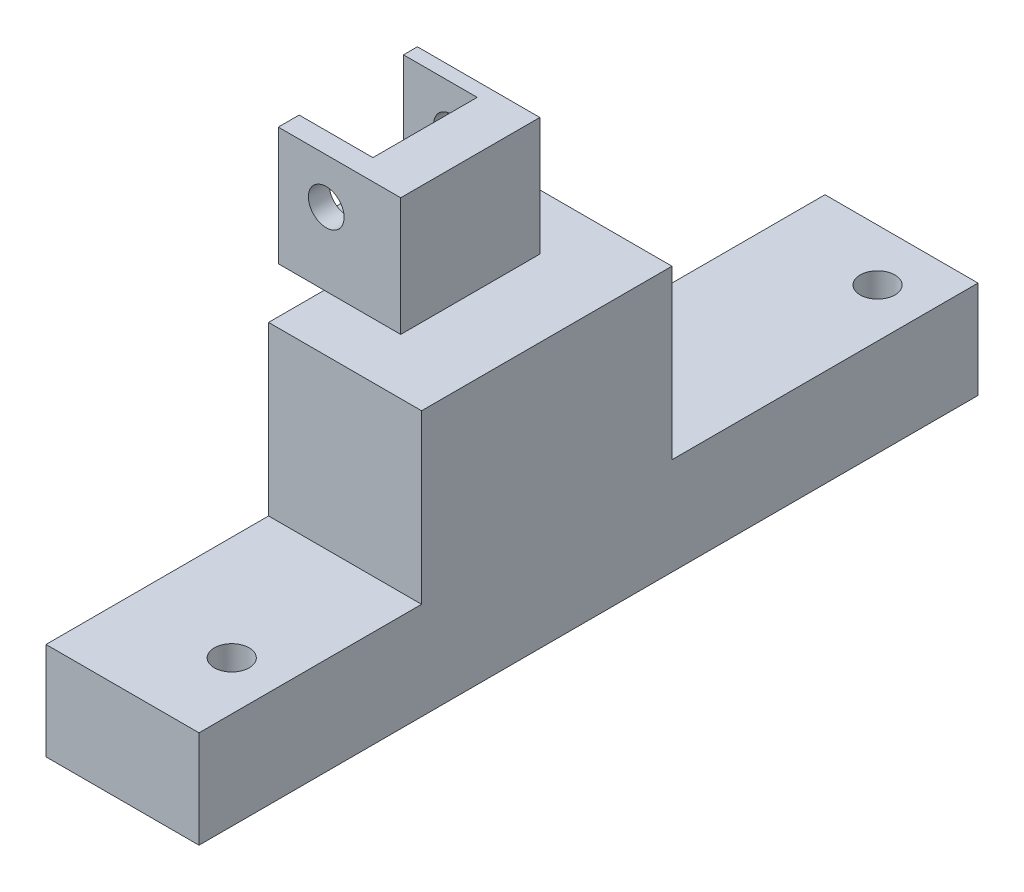
ISO-10303-21;
HEADER;
FILE_DESCRIPTION(('STEP AP214'),'2;1');
FILE_NAME('part.step','',(''),(''),'','','');
FILE_SCHEMA(('AUTOMOTIVE_DESIGN { 1 0 10303 214 1 1 1 1 }'));
ENDSEC;
DATA;
#1=APPLICATION_CONTEXT('core data for automotive mechanical design processes');
#2=APPLICATION_PROTOCOL_DEFINITION('international standard','automotive_design',2000,#1);
#3=PRODUCT_CONTEXT('',#1,'mechanical');
#4=PRODUCT('Part','Part','',(#3));
#5=PRODUCT_RELATED_PRODUCT_CATEGORY('part','',(#4));
#6=PRODUCT_DEFINITION_FORMATION('','',#4);
#7=PRODUCT_DEFINITION_CONTEXT('part definition',#1,'design');
#8=PRODUCT_DEFINITION('design','',#6,#7);
#9=PRODUCT_DEFINITION_SHAPE('','',#8);
#10=(LENGTH_UNIT() NAMED_UNIT(*) SI_UNIT(.MILLI.,.METRE.));
#11=(NAMED_UNIT(*) PLANE_ANGLE_UNIT() SI_UNIT($,.RADIAN.));
#12=(NAMED_UNIT(*) SI_UNIT($,.STERADIAN.) SOLID_ANGLE_UNIT());
#13=UNCERTAINTY_MEASURE_WITH_UNIT(LENGTH_MEASURE(1.E-05),#10,'distance_accuracy_value','');
#14=(GEOMETRIC_REPRESENTATION_CONTEXT(3) GLOBAL_UNCERTAINTY_ASSIGNED_CONTEXT((#13)) GLOBAL_UNIT_ASSIGNED_CONTEXT((#10,
#11,#12)) REPRESENTATION_CONTEXT('',''));
#15=CARTESIAN_POINT('',(0.,0.,0.));
#16=DIRECTION('',(0.,0.,1.));
#17=DIRECTION('',(1.,0.,0.));
#18=AXIS2_PLACEMENT_3D('',#15,#16,#17);
#19=CARTESIAN_POINT('',(801.33832114316,366.294436719435,-21.59));
#20=DIRECTION('',(0.,0.,1.));
#21=DIRECTION('',(1.,0.,0.));
#22=AXIS2_PLACEMENT_3D('',#19,#20,#21);
#23=CYLINDRICAL_SURFACE('',#22,9.52500000000012);
#24=DIRECTION('',(0.,0.,1.));
#25=VECTOR('',#24,1.);
#26=CARTESIAN_POINT('',(806.045825879218,374.574836719435,-21.59));
#27=LINE('',#26,#25);
#28=CARTESIAN_POINT('',(806.045825879218,374.574836719435,-19.05));
#29=VERTEX_POINT('',#28);
#30=CARTESIAN_POINT('',(806.045825879218,374.574836719435,0.));
#31=VERTEX_POINT('',#30);
#32=EDGE_CURVE('E56',#29,#31,#27,.T.);
#33=ORIENTED_EDGE('',*,*,#32,.F.);
#34=CARTESIAN_POINT('',(801.33832114316,366.294436719435,-19.05));
#35=DIRECTION('',(0.,0.,1.));
#36=DIRECTION('',(1.,0.,0.));
#37=AXIS2_PLACEMENT_3D('',#34,#35,#36);
#38=CIRCLE('',#37,9.52500000000004);
#39=CARTESIAN_POINT('',(801.33832114316,356.769436719435,-19.05));
#40=VERTEX_POINT('',#39);
#41=EDGE_CURVE('E290',#29,#40,#38,.F.);
#42=ORIENTED_EDGE('',*,*,#41,.T.);
#43=DIRECTION('',(0.,0.,1.));
#44=VECTOR('',#43,1.);
#45=CARTESIAN_POINT('',(801.338321143161,356.769436719435,-21.59));
#46=LINE('',#45,#44);
#47=CARTESIAN_POINT('',(801.338321143161,356.769436719435,0.));
#48=VERTEX_POINT('',#47);
#49=EDGE_CURVE('E352',#40,#48,#46,.T.);
#50=ORIENTED_EDGE('',*,*,#49,.T.);
#51=CARTESIAN_POINT('',(801.33832114316,366.294436719435,0.));
#52=DIRECTION('',(0.,0.,1.));
#53=DIRECTION('',(1.,0.,0.));
#54=AXIS2_PLACEMENT_3D('',#51,#52,#53);
#55=CIRCLE('',#54,9.52500000000012);
#56=EDGE_CURVE('E334',#48,#31,#55,.T.);
#57=ORIENTED_EDGE('',*,*,#56,.T.);
#58=EDGE_LOOP('',(#33,#42,#50,#57));
#59=FACE_BOUND('',#58,.T.);
#60=ADVANCED_FACE('F47',(#59),#23,.F.);
#61=CARTESIAN_POINT('',(0.,374.574836719435,-21.59));
#62=DIRECTION('',(0.,1.,0.));
#63=DIRECTION('',(0.,0.,1.));
#64=AXIS2_PLACEMENT_3D('',#61,#62,#63);
#65=PLANE('',#64);
#66=DIRECTION('',(-1.,0.,0.));
#67=VECTOR('',#66,1.);
#68=CARTESIAN_POINT('',(0.,374.574836719435,-21.59));
#69=LINE('',#68,#67);
#70=CARTESIAN_POINT('',(814.935825879218,374.574836719435,-21.59));
#71=VERTEX_POINT('',#70);
#72=CARTESIAN_POINT('',(792.583825879217,374.574836719435,-21.59));
#73=VERTEX_POINT('',#72);
#74=EDGE_CURVE('E348',#71,#73,#69,.T.);
#75=ORIENTED_EDGE('',*,*,#74,.T.);
#76=DIRECTION('',(0.,0.,-1.));
#77=VECTOR('',#76,1.);
#78=CARTESIAN_POINT('',(792.583825879217,374.574836719435,6.46807626496378));
#79=LINE('',#78,#77);
#80=CARTESIAN_POINT('',(792.583825879217,374.574836719435,-19.05));
#81=VERTEX_POINT('',#80);
#82=EDGE_CURVE('E277',#81,#73,#79,.T.);
#83=ORIENTED_EDGE('',*,*,#82,.F.);
#84=DIRECTION('',(1.,0.,0.));
#85=VECTOR('',#84,1.);
#86=CARTESIAN_POINT('',(792.583825879217,374.574836719435,-19.05));
#87=LINE('',#86,#85);
#88=EDGE_CURVE('E286',#81,#29,#87,.T.);
#89=ORIENTED_EDGE('',*,*,#88,.T.);
#90=ORIENTED_EDGE('',*,*,#32,.T.);
#91=DIRECTION('',(-1.,0.,0.));
#92=VECTOR('',#91,1.);
#93=CARTESIAN_POINT('',(792.583825879217,374.574836719435,0.));
#94=LINE('',#93,#92);
#95=CARTESIAN_POINT('',(792.583825879217,374.574836719435,0.));
#96=VERTEX_POINT('',#95);
#97=EDGE_CURVE('E304',#31,#96,#94,.T.);
#98=ORIENTED_EDGE('',*,*,#97,.T.);
#99=DIRECTION('',(0.,0.,-1.));
#100=VECTOR('',#99,1.);
#101=CARTESIAN_POINT('',(792.583825879217,374.574836719435,3.81));
#102=LINE('',#101,#100);
#103=CARTESIAN_POINT('',(792.583825879217,374.574836719435,3.81));
#104=VERTEX_POINT('',#103);
#105=EDGE_CURVE('E324',#104,#96,#102,.T.);
#106=ORIENTED_EDGE('',*,*,#105,.F.);
#107=DIRECTION('',(-1.,0.,0.));
#108=VECTOR('',#107,1.);
#109=CARTESIAN_POINT('',(792.583825879217,374.574836719435,3.81));
#110=LINE('',#109,#108);
#111=CARTESIAN_POINT('',(814.935825879218,374.574836719435,3.81));
#112=VERTEX_POINT('',#111);
#113=EDGE_CURVE('E317',#112,#104,#110,.T.);
#114=ORIENTED_EDGE('',*,*,#113,.F.);
#115=DIRECTION('',(0.,0.,1.));
#116=VECTOR('',#115,1.);
#117=CARTESIAN_POINT('',(814.935825879218,374.574836719435,-21.59));
#118=LINE('',#117,#116);
#119=EDGE_CURVE('E361',#71,#112,#118,.T.);
#120=ORIENTED_EDGE('',*,*,#119,.F.);
#121=EDGE_LOOP('',(#75,#83,#89,#90,#98,#106,#114,#120));
#122=FACE_BOUND('',#121,.T.);
#123=ADVANCED_FACE('F431',(#122),#65,.T.);
#124=CARTESIAN_POINT('',(814.935825879218,0.,-21.59));
#125=DIRECTION('',(1.,0.,0.));
#126=DIRECTION('',(0.,0.,-1.));
#127=AXIS2_PLACEMENT_3D('',#124,#125,#126);
#128=PLANE('',#127);
#129=ORIENTED_EDGE('',*,*,#119,.T.);
#130=DIRECTION('',(0.,1.,0.));
#131=VECTOR('',#130,1.);
#132=CARTESIAN_POINT('',(814.935825879218,374.574836719435,3.81));
#133=LINE('',#132,#131);
#134=CARTESIAN_POINT('',(814.935825879218,352.959436719435,3.81));
#135=VERTEX_POINT('',#134);
#136=EDGE_CURVE('E312',#135,#112,#133,.T.);
#137=ORIENTED_EDGE('',*,*,#136,.F.);
#138=DIRECTION('',(0.,0.,1.));
#139=VECTOR('',#138,1.);
#140=CARTESIAN_POINT('',(814.935825879218,352.959436719435,-21.59));
#141=LINE('',#140,#139);
#142=CARTESIAN_POINT('',(814.935825879218,352.959436719435,-21.59));
#143=VERTEX_POINT('',#142);
#144=EDGE_CURVE('E364',#143,#135,#141,.T.);
#145=ORIENTED_EDGE('',*,*,#144,.F.);
#146=DIRECTION('',(0.,1.,0.));
#147=VECTOR('',#146,1.);
#148=CARTESIAN_POINT('',(814.935825879218,0.,-21.59));
#149=LINE('',#148,#147);
#150=EDGE_CURVE('E344',#143,#71,#149,.T.);
#151=ORIENTED_EDGE('',*,*,#150,.T.);
#152=EDGE_LOOP('',(#129,#137,#145,#151));
#153=FACE_BOUND('',#152,.T.);
#154=ADVANCED_FACE('F437',(#153),#128,.T.);
#155=CARTESIAN_POINT('',(0.,352.959436719435,-21.59));
#156=DIRECTION('',(0.,-1.,0.));
#157=DIRECTION('',(0.,0.,-1.));
#158=AXIS2_PLACEMENT_3D('',#155,#156,#157);
#159=PLANE('',#158);
#160=DIRECTION('',(0.,0.,-1.));
#161=VECTOR('',#160,1.);
#162=CARTESIAN_POINT('',(800.965825879218,352.959436719435,54.61));
#163=LINE('',#162,#161);
#164=CARTESIAN_POINT('',(800.965825879218,352.959436719435,3.81));
#165=VERTEX_POINT('',#164);
#166=CARTESIAN_POINT('',(800.965825879218,352.959436719435,-21.59));
#167=VERTEX_POINT('',#166);
#168=EDGE_CURVE('E11',#165,#167,#163,.T.);
#169=ORIENTED_EDGE('',*,*,#168,.F.);
#170=DIRECTION('',(1.,0.,0.));
#171=VECTOR('',#170,1.);
#172=CARTESIAN_POINT('',(814.935825879218,352.959436719435,3.81));
#173=LINE('',#172,#171);
#174=CARTESIAN_POINT('',(792.583825879217,352.959436719435,3.81));
#175=VERTEX_POINT('',#174);
#176=EDGE_CURVE('E308',#175,#165,#173,.T.);
#177=ORIENTED_EDGE('',*,*,#176,.F.);
#178=DIRECTION('',(0.,0.,1.));
#179=VECTOR('',#178,1.);
#180=CARTESIAN_POINT('',(792.583825879217,352.959436719435,-21.59));
#181=LINE('',#180,#179);
#182=CARTESIAN_POINT('',(792.583825879217,352.959436719435,-21.59));
#183=VERTEX_POINT('',#182);
#184=EDGE_CURVE('E368',#183,#175,#181,.T.);
#185=ORIENTED_EDGE('',*,*,#184,.F.);
#186=DIRECTION('',(1.,0.,0.));
#187=VECTOR('',#186,1.);
#188=CARTESIAN_POINT('',(0.,352.959436719435,-21.59));
#189=LINE('',#188,#187);
#190=EDGE_CURVE('E341',#183,#167,#189,.T.);
#191=ORIENTED_EDGE('',*,*,#190,.T.);
#192=EDGE_LOOP('',(#169,#177,#185,#191));
#193=FACE_BOUND('',#192,.T.);
#194=ADVANCED_FACE('F478',(#193),#159,.T.);
#195=CARTESIAN_POINT('',(792.583825879217,0.,-21.59));
#196=DIRECTION('',(-1.,0.,0.));
#197=DIRECTION('',(0.,0.,1.));
#198=AXIS2_PLACEMENT_3D('',#195,#196,#197);
#199=PLANE('',#198);
#200=ORIENTED_EDGE('',*,*,#184,.T.);
#201=DIRECTION('',(0.,-1.,0.));
#202=VECTOR('',#201,1.);
#203=CARTESIAN_POINT('',(792.583825879217,352.959436719435,3.81));
#204=LINE('',#203,#202);
#205=EDGE_CURVE('E320',#104,#175,#204,.T.);
#206=ORIENTED_EDGE('',*,*,#205,.F.);
#207=ORIENTED_EDGE('',*,*,#105,.T.);
#208=DIRECTION('',(0.,-1.,0.));
#209=VECTOR('',#208,1.);
#210=CARTESIAN_POINT('',(792.583825879217,352.959436719435,0.));
#211=LINE('',#210,#209);
#212=CARTESIAN_POINT('',(792.583825879217,356.769436719435,0.));
#213=VERTEX_POINT('',#212);
#214=EDGE_CURVE('E327',#96,#213,#211,.T.);
#215=ORIENTED_EDGE('',*,*,#214,.T.);
#216=DIRECTION('',(0.,0.,1.));
#217=VECTOR('',#216,1.);
#218=CARTESIAN_POINT('',(792.583825879217,356.769436719435,-21.59));
#219=LINE('',#218,#217);
#220=CARTESIAN_POINT('',(792.583825879217,356.769436719435,-19.05));
#221=VERTEX_POINT('',#220);
#222=EDGE_CURVE('E371',#221,#213,#219,.T.);
#223=ORIENTED_EDGE('',*,*,#222,.F.);
#224=DIRECTION('',(0.,1.,0.));
#225=VECTOR('',#224,1.);
#226=CARTESIAN_POINT('',(792.583825879217,356.769436719435,-19.05));
#227=LINE('',#226,#225);
#228=EDGE_CURVE('E282',#221,#81,#227,.T.);
#229=ORIENTED_EDGE('',*,*,#228,.T.);
#230=ORIENTED_EDGE('',*,*,#82,.T.);
#231=DIRECTION('',(0.,-1.,0.));
#232=VECTOR('',#231,1.);
#233=CARTESIAN_POINT('',(792.583825879217,0.,-21.59));
#234=LINE('',#233,#232);
#235=EDGE_CURVE('E335',#73,#183,#234,.T.);
#236=ORIENTED_EDGE('',*,*,#235,.T.);
#237=EDGE_LOOP('',(#200,#206,#207,#215,#223,#229,#230,#236));
#238=FACE_BOUND('',#237,.T.);
#239=ADVANCED_FACE('F452',(#238),#199,.T.);
#240=CARTESIAN_POINT('',(0.,356.769436719435,-21.59));
#241=DIRECTION('',(0.,-1.,0.));
#242=DIRECTION('',(0.,0.,-1.));
#243=AXIS2_PLACEMENT_3D('',#240,#241,#242);
#244=PLANE('',#243);
#245=ORIENTED_EDGE('',*,*,#49,.F.);
#246=DIRECTION('',(-1.,0.,0.));
#247=VECTOR('',#246,1.);
#248=CARTESIAN_POINT('',(801.33832114316,356.769436719435,-19.05));
#249=LINE('',#248,#247);
#250=EDGE_CURVE('E268',#40,#221,#249,.T.);
#251=ORIENTED_EDGE('',*,*,#250,.T.);
#252=ORIENTED_EDGE('',*,*,#222,.T.);
#253=DIRECTION('',(1.,0.,0.));
#254=VECTOR('',#253,1.);
#255=CARTESIAN_POINT('',(0.,356.769436719435,0.));
#256=LINE('',#255,#254);
#257=EDGE_CURVE('E340',#213,#48,#256,.T.);
#258=ORIENTED_EDGE('',*,*,#257,.T.);
#259=EDGE_LOOP('',(#245,#251,#252,#258));
#260=FACE_BOUND('',#259,.T.);
#261=ADVANCED_FACE('F470',(#260),#244,.F.);
#262=CARTESIAN_POINT('',(0.,0.,-21.59));
#263=DIRECTION('',(0.,0.,1.));
#264=DIRECTION('',(1.,0.,0.));
#265=AXIS2_PLACEMENT_3D('',#262,#263,#264);
#266=PLANE('',#265);
#267=ORIENTED_EDGE('',*,*,#235,.F.);
#268=ORIENTED_EDGE('',*,*,#74,.F.);
#269=ORIENTED_EDGE('',*,*,#150,.F.);
#270=EDGE_CURVE('E339',#167,#143,#189,.T.);
#271=ORIENTED_EDGE('',*,*,#270,.F.);
#272=ORIENTED_EDGE('',*,*,#190,.F.);
#273=EDGE_LOOP('',(#267,#268,#269,#271,#272));
#274=FACE_BOUND('',#273,.T.);
#275=CARTESIAN_POINT('',(801.33832114316,366.294436719435,-21.59));
#276=DIRECTION('',(0.,0.,-1.));
#277=DIRECTION('',(-1.,0.,0.));
#278=AXIS2_PLACEMENT_3D('',#275,#276,#277);
#279=CIRCLE('',#278,3.26389999999989);
#280=CARTESIAN_POINT('',(798.07442114316,366.294436719435,-21.59));
#281=VERTEX_POINT('',#280);
#282=EDGE_CURVE('E272',#281,#281,#279,.T.);
#283=ORIENTED_EDGE('',*,*,#282,.F.);
#284=EDGE_LOOP('',(#283));
#285=FACE_BOUND('',#284,.T.);
#286=ADVANCED_FACE('F463',(#274,#285),#266,.F.);
#287=CARTESIAN_POINT('',(0.,0.,0.));
#288=DIRECTION('',(0.,0.,-1.));
#289=DIRECTION('',(-1.,0.,0.));
#290=AXIS2_PLACEMENT_3D('',#287,#288,#289);
#291=PLANE('',#290);
#292=CARTESIAN_POINT('',(801.338321143161,366.294436719435,0.));
#293=DIRECTION('',(0.,0.,1.));
#294=DIRECTION('',(1.,0.,0.));
#295=AXIS2_PLACEMENT_3D('',#292,#293,#294);
#296=CIRCLE('',#295,3.26390000000001);
#297=CARTESIAN_POINT('',(804.60222114316,366.294436719435,0.));
#298=VERTEX_POINT('',#297);
#299=EDGE_CURVE('E281',#298,#298,#296,.T.);
#300=ORIENTED_EDGE('',*,*,#299,.T.);
#301=EDGE_LOOP('',(#300));
#302=FACE_BOUND('',#301,.T.);
#303=ORIENTED_EDGE('',*,*,#56,.F.);
#304=ORIENTED_EDGE('',*,*,#257,.F.);
#305=ORIENTED_EDGE('',*,*,#214,.F.);
#306=ORIENTED_EDGE('',*,*,#97,.F.);
#307=EDGE_LOOP('',(#303,#304,#305,#306));
#308=FACE_BOUND('',#307,.T.);
#309=ADVANCED_FACE('F448',(#302,#308),#291,.T.);
#310=CARTESIAN_POINT('',(0.,0.,3.81));
#311=DIRECTION('',(0.,0.,-1.));
#312=DIRECTION('',(-1.,0.,0.));
#313=AXIS2_PLACEMENT_3D('',#310,#311,#312);
#314=PLANE('',#313);
#315=ORIENTED_EDGE('',*,*,#176,.T.);
#316=EDGE_CURVE('E313',#165,#135,#173,.T.);
#317=ORIENTED_EDGE('',*,*,#316,.T.);
#318=ORIENTED_EDGE('',*,*,#136,.T.);
#319=ORIENTED_EDGE('',*,*,#113,.T.);
#320=ORIENTED_EDGE('',*,*,#205,.T.);
#321=EDGE_LOOP('',(#315,#317,#318,#319,#320));
#322=FACE_BOUND('',#321,.T.);
#323=CARTESIAN_POINT('',(801.338321143161,366.294436719435,3.81));
#324=DIRECTION('',(0.,0.,1.));
#325=DIRECTION('',(1.,0.,0.));
#326=AXIS2_PLACEMENT_3D('',#323,#324,#325);
#327=CIRCLE('',#326,3.26390000000001);
#328=CARTESIAN_POINT('',(804.60222114316,366.294436719435,3.81));
#329=VERTEX_POINT('',#328);
#330=EDGE_CURVE('E300',#329,#329,#327,.T.);
#331=ORIENTED_EDGE('',*,*,#330,.F.);
#332=EDGE_LOOP('',(#331));
#333=FACE_BOUND('',#332,.T.);
#334=ADVANCED_FACE('F455',(#322,#333),#314,.F.);
#335=CARTESIAN_POINT('',(801.338321143161,366.294436719435,3.81));
#336=DIRECTION('',(0.,0.,-1.));
#337=DIRECTION('',(-1.,0.,0.));
#338=AXIS2_PLACEMENT_3D('',#335,#336,#337);
#339=CYLINDRICAL_SURFACE('',#338,3.26390000000001);
#340=ORIENTED_EDGE('',*,*,#330,.T.);
#341=EDGE_LOOP('',(#340));
#342=FACE_BOUND('',#341,.T.);
#343=ORIENTED_EDGE('',*,*,#299,.F.);
#344=EDGE_LOOP('',(#343));
#345=FACE_BOUND('',#344,.T.);
#346=ADVANCED_FACE('F491',(#342,#345),#339,.F.);
#347=CARTESIAN_POINT('',(801.33832114316,366.294436719435,6.46807626496378));
#348=DIRECTION('',(0.,0.,-1.));
#349=DIRECTION('',(-1.,0.,0.));
#350=AXIS2_PLACEMENT_3D('',#347,#348,#349);
#351=CYLINDRICAL_SURFACE('',#350,3.26389999999989);
#352=ORIENTED_EDGE('',*,*,#282,.T.);
#353=EDGE_LOOP('',(#352));
#354=FACE_BOUND('',#353,.T.);
#355=CARTESIAN_POINT('',(801.33832114316,366.294436719435,-19.05));
#356=DIRECTION('',(0.,0.,1.));
#357=DIRECTION('',(1.,0.,0.));
#358=AXIS2_PLACEMENT_3D('',#355,#356,#357);
#359=CIRCLE('',#358,3.26389999999989);
#360=CARTESIAN_POINT('',(804.60222114316,366.294436719435,-19.05));
#361=VERTEX_POINT('',#360);
#362=EDGE_CURVE('E276',#361,#361,#359,.F.);
#363=ORIENTED_EDGE('',*,*,#362,.F.);
#364=EDGE_LOOP('',(#363));
#365=FACE_BOUND('',#364,.T.);
#366=ADVANCED_FACE('F493',(#354,#365),#351,.F.);
#367=CARTESIAN_POINT('',(801.338321143161,358.014036719435,-19.05));
#368=DIRECTION('',(0.,0.,1.));
#369=DIRECTION('',(1.,0.,0.));
#370=AXIS2_PLACEMENT_3D('',#367,#368,#369);
#371=PLANE('',#370);
#372=ORIENTED_EDGE('',*,*,#250,.F.);
#373=ORIENTED_EDGE('',*,*,#41,.F.);
#374=ORIENTED_EDGE('',*,*,#88,.F.);
#375=ORIENTED_EDGE('',*,*,#228,.F.);
#376=EDGE_LOOP('',(#372,#373,#374,#375));
#377=FACE_BOUND('',#376,.T.);
#378=ORIENTED_EDGE('',*,*,#362,.T.);
#379=EDGE_LOOP('',(#378));
#380=FACE_BOUND('',#379,.T.);
#381=ADVANCED_FACE('F467',(#377,#380),#371,.T.);
#382=CARTESIAN_POINT('',(0.,352.959436719435,0.));
#383=DIRECTION('',(0.,-1.,0.));
#384=DIRECTION('',(0.,0.,-1.));
#385=AXIS2_PLACEMENT_3D('',#382,#383,#384);
#386=PLANE('',#385);
#387=CARTESIAN_POINT('',(800.965825879218,352.959436719435,13.97));
#388=VERTEX_POINT('',#387);
#389=EDGE_CURVE('E58',#388,#165,#163,.T.);
#390=ORIENTED_EDGE('',*,*,#389,.F.);
#391=DIRECTION('',(1.,0.,0.));
#392=VECTOR('',#391,1.);
#393=CARTESIAN_POINT('',(798.679825879218,352.959436719435,13.97));
#394=LINE('',#393,#392);
#395=CARTESIAN_POINT('',(828.905825879218,352.959436719435,13.97));
#396=VERTEX_POINT('',#395);
#397=EDGE_CURVE('E180',#388,#396,#394,.T.);
#398=ORIENTED_EDGE('',*,*,#397,.T.);
#399=DIRECTION('',(0.,0.,1.));
#400=VECTOR('',#399,1.);
#401=CARTESIAN_POINT('',(828.905825879218,352.959436719435,-87.63));
#402=LINE('',#401,#400);
#403=CARTESIAN_POINT('',(828.905825879218,352.959436719435,-31.75));
#404=VERTEX_POINT('',#403);
#405=EDGE_CURVE('E193',#404,#396,#402,.T.);
#406=ORIENTED_EDGE('',*,*,#405,.F.);
#407=DIRECTION('',(1.,0.,0.));
#408=VECTOR('',#407,1.);
#409=CARTESIAN_POINT('',(798.679825879218,352.959436719435,-31.75));
#410=LINE('',#409,#408);
#411=CARTESIAN_POINT('',(800.965825879218,352.959436719435,-31.75));
#412=VERTEX_POINT('',#411);
#413=EDGE_CURVE('E66',#412,#404,#410,.T.);
#414=ORIENTED_EDGE('',*,*,#413,.F.);
#415=EDGE_CURVE('E59',#167,#412,#163,.T.);
#416=ORIENTED_EDGE('',*,*,#415,.F.);
#417=ORIENTED_EDGE('',*,*,#270,.T.);
#418=ORIENTED_EDGE('',*,*,#144,.T.);
#419=ORIENTED_EDGE('',*,*,#316,.F.);
#420=EDGE_LOOP('',(#390,#398,#406,#414,#416,#417,#418,#419));
#421=FACE_BOUND('',#420,.T.);
#422=ADVANCED_FACE('F410',(#421),#386,.F.);
#423=CARTESIAN_POINT('',(828.905825879218,159.613263974457,54.61));
#424=DIRECTION('',(0.,0.,-1.));
#425=DIRECTION('',(-1.,0.,0.));
#426=AXIS2_PLACEMENT_3D('',#423,#424,#425);
#427=PLANE('',#426);
#428=DIRECTION('',(0.,1.,0.));
#429=VECTOR('',#428,1.);
#430=CARTESIAN_POINT('',(828.905825879218,159.613263974457,54.61));
#431=LINE('',#430,#429);
#432=CARTESIAN_POINT('',(828.905825879218,304.5714,54.61));
#433=VERTEX_POINT('',#432);
#434=CARTESIAN_POINT('',(828.905825879218,322.3514,54.61));
#435=VERTEX_POINT('',#434);
#436=EDGE_CURVE('E249',#433,#435,#431,.T.);
#437=ORIENTED_EDGE('',*,*,#436,.T.);
#438=DIRECTION('',(1.,0.,0.));
#439=VECTOR('',#438,1.);
#440=CARTESIAN_POINT('',(798.679825879218,322.3514,54.61));
#441=LINE('',#440,#439);
#442=CARTESIAN_POINT('',(800.965825879218,322.3514,54.61));
#443=VERTEX_POINT('',#442);
#444=EDGE_CURVE('E74',#443,#435,#441,.T.);
#445=ORIENTED_EDGE('',*,*,#444,.F.);
#446=DIRECTION('',(0.,1.,0.));
#447=VECTOR('',#446,1.);
#448=CARTESIAN_POINT('',(800.965825879218,159.613263974457,54.61));
#449=LINE('',#448,#447);
#450=CARTESIAN_POINT('',(800.965825879218,304.5714,54.61));
#451=VERTEX_POINT('',#450);
#452=EDGE_CURVE('E236',#451,#443,#449,.T.);
#453=ORIENTED_EDGE('',*,*,#452,.F.);
#454=DIRECTION('',(1.,0.,0.));
#455=VECTOR('',#454,1.);
#456=CARTESIAN_POINT('',(828.905825879218,304.5714,54.61));
#457=LINE('',#456,#455);
#458=EDGE_CURVE('E229',#451,#433,#457,.T.);
#459=ORIENTED_EDGE('',*,*,#458,.T.);
#460=EDGE_LOOP('',(#437,#445,#453,#459));
#461=FACE_BOUND('',#460,.T.);
#462=ADVANCED_FACE('F405',(#461),#427,.F.);
#463=CARTESIAN_POINT('',(800.965825879218,159.613263974457,54.61));
#464=DIRECTION('',(1.,0.,0.));
#465=DIRECTION('',(0.,0.,-1.));
#466=AXIS2_PLACEMENT_3D('',#463,#464,#465);
#467=PLANE('',#466);
#468=DIRECTION('',(0.,0.,-1.));
#469=VECTOR('',#468,1.);
#470=CARTESIAN_POINT('',(800.965825879218,322.3514,54.61));
#471=LINE('',#470,#469);
#472=CARTESIAN_POINT('',(800.965825879218,322.3514,13.97));
#473=VERTEX_POINT('',#472);
#474=EDGE_CURVE('E220',#443,#473,#471,.T.);
#475=ORIENTED_EDGE('',*,*,#474,.T.);
#476=DIRECTION('',(0.,1.,0.));
#477=VECTOR('',#476,1.);
#478=CARTESIAN_POINT('',(800.965825879218,159.613263974457,13.97));
#479=LINE('',#478,#477);
#480=EDGE_CURVE('E177',#473,#388,#479,.T.);
#481=ORIENTED_EDGE('',*,*,#480,.T.);
#482=ORIENTED_EDGE('',*,*,#389,.T.);
#483=ORIENTED_EDGE('',*,*,#168,.T.);
#484=ORIENTED_EDGE('',*,*,#415,.T.);
#485=DIRECTION('',(0.,-1.,0.));
#486=VECTOR('',#485,1.);
#487=CARTESIAN_POINT('',(800.965825879218,159.613263974457,-31.7500000000001));
#488=LINE('',#487,#486);
#489=CARTESIAN_POINT('',(800.965825879218,322.3514,-31.75));
#490=VERTEX_POINT('',#489);
#491=EDGE_CURVE('E223',#412,#490,#488,.T.);
#492=ORIENTED_EDGE('',*,*,#491,.T.);
#493=DIRECTION('',(0.,0.,-1.));
#494=VECTOR('',#493,1.);
#495=CARTESIAN_POINT('',(800.965825879218,322.3514,54.61));
#496=LINE('',#495,#494);
#497=CARTESIAN_POINT('',(800.965825879218,322.3514,-87.63));
#498=VERTEX_POINT('',#497);
#499=EDGE_CURVE('E216',#490,#498,#496,.T.);
#500=ORIENTED_EDGE('',*,*,#499,.T.);
#501=DIRECTION('',(0.,1.,0.));
#502=VECTOR('',#501,1.);
#503=CARTESIAN_POINT('',(800.965825879218,159.613263974457,-87.63));
#504=LINE('',#503,#502);
#505=CARTESIAN_POINT('',(800.965825879218,304.5714,-87.63));
#506=VERTEX_POINT('',#505);
#507=EDGE_CURVE('E241',#506,#498,#504,.T.);
#508=ORIENTED_EDGE('',*,*,#507,.F.);
#509=DIRECTION('',(0.,0.,1.));
#510=VECTOR('',#509,1.);
#511=CARTESIAN_POINT('',(800.965825879218,304.5714,54.61));
#512=LINE('',#511,#510);
#513=EDGE_CURVE('E240',#506,#451,#512,.T.);
#514=ORIENTED_EDGE('',*,*,#513,.T.);
#515=ORIENTED_EDGE('',*,*,#452,.T.);
#516=EDGE_LOOP('',(#475,#481,#482,#483,#484,#492,#500,#508,#514,#515));
#517=FACE_BOUND('',#516,.T.);
#518=ADVANCED_FACE('F400',(#517),#467,.F.);
#519=CARTESIAN_POINT('',(800.965825879218,159.613263974457,-87.63));
#520=DIRECTION('',(0.,0.,1.));
#521=DIRECTION('',(1.,0.,0.));
#522=AXIS2_PLACEMENT_3D('',#519,#520,#521);
#523=PLANE('',#522);
#524=ORIENTED_EDGE('',*,*,#507,.T.);
#525=DIRECTION('',(1.,0.,0.));
#526=VECTOR('',#525,1.);
#527=CARTESIAN_POINT('',(798.679825879218,322.3514,-87.63));
#528=LINE('',#527,#526);
#529=CARTESIAN_POINT('',(828.905825879218,322.3514,-87.63));
#530=VERTEX_POINT('',#529);
#531=EDGE_CURVE('E208',#498,#530,#528,.T.);
#532=ORIENTED_EDGE('',*,*,#531,.T.);
#533=DIRECTION('',(0.,1.,0.));
#534=VECTOR('',#533,1.);
#535=CARTESIAN_POINT('',(828.905825879218,159.613263974457,-87.63));
#536=LINE('',#535,#534);
#537=CARTESIAN_POINT('',(828.905825879218,304.5714,-87.63));
#538=VERTEX_POINT('',#537);
#539=EDGE_CURVE('E232',#538,#530,#536,.T.);
#540=ORIENTED_EDGE('',*,*,#539,.F.);
#541=DIRECTION('',(-1.,0.,0.));
#542=VECTOR('',#541,1.);
#543=CARTESIAN_POINT('',(800.965825879218,304.5714,-87.63));
#544=LINE('',#543,#542);
#545=EDGE_CURVE('E235',#538,#506,#544,.T.);
#546=ORIENTED_EDGE('',*,*,#545,.T.);
#547=EDGE_LOOP('',(#524,#532,#540,#546));
#548=FACE_BOUND('',#547,.T.);
#549=ADVANCED_FACE('F402',(#548),#523,.F.);
#550=CARTESIAN_POINT('',(828.905825879218,159.613263974457,-87.63));
#551=DIRECTION('',(-1.,0.,0.));
#552=DIRECTION('',(0.,0.,1.));
#553=AXIS2_PLACEMENT_3D('',#550,#551,#552);
#554=PLANE('',#553);
#555=ORIENTED_EDGE('',*,*,#405,.T.);
#556=DIRECTION('',(0.,1.,0.));
#557=VECTOR('',#556,1.);
#558=CARTESIAN_POINT('',(828.905825879218,322.3514,13.97));
#559=LINE('',#558,#557);
#560=CARTESIAN_POINT('',(828.905825879218,322.3514,13.97));
#561=VERTEX_POINT('',#560);
#562=EDGE_CURVE('E174',#561,#396,#559,.T.);
#563=ORIENTED_EDGE('',*,*,#562,.F.);
#564=DIRECTION('',(0.,0.,-1.));
#565=VECTOR('',#564,1.);
#566=CARTESIAN_POINT('',(828.905825879218,322.3514,54.61));
#567=LINE('',#566,#565);
#568=EDGE_CURVE('E182',#435,#561,#567,.T.);
#569=ORIENTED_EDGE('',*,*,#568,.F.);
#570=ORIENTED_EDGE('',*,*,#436,.F.);
#571=DIRECTION('',(0.,0.,-1.));
#572=VECTOR('',#571,1.);
#573=CARTESIAN_POINT('',(828.905825879218,304.5714,-87.63));
#574=LINE('',#573,#572);
#575=EDGE_CURVE('E245',#433,#538,#574,.T.);
#576=ORIENTED_EDGE('',*,*,#575,.T.);
#577=ORIENTED_EDGE('',*,*,#539,.T.);
#578=DIRECTION('',(0.,0.,-1.));
#579=VECTOR('',#578,1.);
#580=CARTESIAN_POINT('',(828.905825879218,322.3514,-31.75));
#581=LINE('',#580,#579);
#582=CARTESIAN_POINT('',(828.905825879218,322.3514,-31.75));
#583=VERTEX_POINT('',#582);
#584=EDGE_CURVE('E204',#583,#530,#581,.T.);
#585=ORIENTED_EDGE('',*,*,#584,.F.);
#586=DIRECTION('',(0.,-1.,0.));
#587=VECTOR('',#586,1.);
#588=CARTESIAN_POINT('',(828.905825879218,352.959436719435,-31.75));
#589=LINE('',#588,#587);
#590=EDGE_CURVE('E188',#404,#583,#589,.T.);
#591=ORIENTED_EDGE('',*,*,#590,.F.);
#592=EDGE_LOOP('',(#555,#563,#569,#570,#576,#577,#585,#591));
#593=FACE_BOUND('',#592,.T.);
#594=ADVANCED_FACE('F191',(#593),#554,.F.);
#595=CARTESIAN_POINT('',(820.039,159.613263974457,39.7685714285709));
#596=DIRECTION('',(0.,1.,0.));
#597=DIRECTION('',(0.,0.,1.));
#598=AXIS2_PLACEMENT_3D('',#595,#596,#597);
#599=CYLINDRICAL_SURFACE('',#598,3.17500000000008);
#600=CARTESIAN_POINT('',(820.039,322.3514,39.7685714285709));
#601=DIRECTION('',(0.,-1.,0.));
#602=DIRECTION('',(0.,0.,-1.));
#603=AXIS2_PLACEMENT_3D('',#600,#601,#602);
#604=CIRCLE('',#603,3.17500000000008);
#605=CARTESIAN_POINT('',(820.039,322.3514,36.5935714285708));
#606=VERTEX_POINT('',#605);
#607=EDGE_CURVE('E50',#606,#606,#604,.T.);
#608=ORIENTED_EDGE('',*,*,#607,.F.);
#609=EDGE_LOOP('',(#608));
#610=FACE_BOUND('',#609,.T.);
#611=CARTESIAN_POINT('',(820.039,304.5714,39.7685714285709));
#612=DIRECTION('',(0.,1.,0.));
#613=DIRECTION('',(0.,0.,1.));
#614=AXIS2_PLACEMENT_3D('',#611,#612,#613);
#615=CIRCLE('',#614,3.17500000000008);
#616=CARTESIAN_POINT('',(820.039,304.5714,42.943571428571));
#617=VERTEX_POINT('',#616);
#618=EDGE_CURVE('E264',#617,#617,#615,.T.);
#619=ORIENTED_EDGE('',*,*,#618,.F.);
#620=EDGE_LOOP('',(#619));
#621=FACE_BOUND('',#620,.T.);
#622=ADVANCED_FACE('F386',(#610,#621),#599,.F.);
#623=CARTESIAN_POINT('',(820.039,159.613263974457,-78.1600000000006));
#624=DIRECTION('',(0.,1.,0.));
#625=DIRECTION('',(0.,0.,1.));
#626=AXIS2_PLACEMENT_3D('',#623,#624,#625);
#627=CYLINDRICAL_SURFACE('',#626,3.17500000000008);
#628=CARTESIAN_POINT('',(820.039,322.3514,-78.1600000000006));
#629=DIRECTION('',(0.,-1.,0.));
#630=DIRECTION('',(0.,0.,-1.));
#631=AXIS2_PLACEMENT_3D('',#628,#629,#630);
#632=CIRCLE('',#631,3.17500000000008);
#633=CARTESIAN_POINT('',(820.039,322.3514,-81.3350000000007));
#634=VERTEX_POINT('',#633);
#635=EDGE_CURVE('E200',#634,#634,#632,.T.);
#636=ORIENTED_EDGE('',*,*,#635,.F.);
#637=EDGE_LOOP('',(#636));
#638=FACE_BOUND('',#637,.T.);
#639=CARTESIAN_POINT('',(820.039,304.5714,-78.1600000000006));
#640=DIRECTION('',(0.,1.,0.));
#641=DIRECTION('',(0.,0.,1.));
#642=AXIS2_PLACEMENT_3D('',#639,#640,#641);
#643=CIRCLE('',#642,3.17500000000008);
#644=CARTESIAN_POINT('',(820.039,304.5714,-74.9850000000005));
#645=VERTEX_POINT('',#644);
#646=EDGE_CURVE('E231',#645,#645,#643,.T.);
#647=ORIENTED_EDGE('',*,*,#646,.F.);
#648=EDGE_LOOP('',(#647));
#649=FACE_BOUND('',#648,.T.);
#650=ADVANCED_FACE('F382',(#638,#649),#627,.F.);
#651=CARTESIAN_POINT('',(820.038999999999,304.5714,39.7685714285707));
#652=DIRECTION('',(0.,1.,0.));
#653=DIRECTION('',(-0.356625051962963,0.,0.934247596899459));
#654=AXIS2_PLACEMENT_3D('',#651,#652,#653);
#655=PLANE('',#654);
#656=ORIENTED_EDGE('',*,*,#646,.T.);
#657=EDGE_LOOP('',(#656));
#658=FACE_BOUND('',#657,.T.);
#659=ORIENTED_EDGE('',*,*,#618,.T.);
#660=EDGE_LOOP('',(#659));
#661=FACE_BOUND('',#660,.T.);
#662=ORIENTED_EDGE('',*,*,#513,.F.);
#663=ORIENTED_EDGE('',*,*,#545,.F.);
#664=ORIENTED_EDGE('',*,*,#575,.F.);
#665=ORIENTED_EDGE('',*,*,#458,.F.);
#666=EDGE_LOOP('',(#662,#663,#664,#665));
#667=FACE_BOUND('',#666,.T.);
#668=ADVANCED_FACE('F385',(#658,#661,#667),#655,.F.);
#669=CARTESIAN_POINT('',(798.679825879218,352.959436719435,-31.75));
#670=DIRECTION('',(0.,0.,1.));
#671=DIRECTION('',(0.,-1.,0.));
#672=AXIS2_PLACEMENT_3D('',#669,#670,#671);
#673=PLANE('',#672);
#674=ORIENTED_EDGE('',*,*,#413,.T.);
#675=ORIENTED_EDGE('',*,*,#590,.T.);
#676=DIRECTION('',(1.,0.,0.));
#677=VECTOR('',#676,1.);
#678=CARTESIAN_POINT('',(798.679825879218,322.3514,-31.75));
#679=LINE('',#678,#677);
#680=EDGE_CURVE('E205',#490,#583,#679,.T.);
#681=ORIENTED_EDGE('',*,*,#680,.F.);
#682=ORIENTED_EDGE('',*,*,#491,.F.);
#683=EDGE_LOOP('',(#674,#675,#681,#682));
#684=FACE_BOUND('',#683,.T.);
#685=ADVANCED_FACE('F392',(#684),#673,.F.);
#686=CARTESIAN_POINT('',(798.679825879218,322.3514,-31.75));
#687=DIRECTION('',(0.,-1.,0.));
#688=DIRECTION('',(0.,0.,-1.));
#689=AXIS2_PLACEMENT_3D('',#686,#687,#688);
#690=PLANE('',#689);
#691=ORIENTED_EDGE('',*,*,#635,.T.);
#692=EDGE_LOOP('',(#691));
#693=FACE_BOUND('',#692,.T.);
#694=ORIENTED_EDGE('',*,*,#680,.T.);
#695=ORIENTED_EDGE('',*,*,#584,.T.);
#696=ORIENTED_EDGE('',*,*,#531,.F.);
#697=ORIENTED_EDGE('',*,*,#499,.F.);
#698=EDGE_LOOP('',(#694,#695,#696,#697));
#699=FACE_BOUND('',#698,.T.);
#700=ADVANCED_FACE('F379',(#693,#699),#690,.F.);
#701=CARTESIAN_POINT('',(798.679825879218,322.3514,13.97));
#702=DIRECTION('',(0.,0.,-1.));
#703=DIRECTION('',(-1.,0.,0.));
#704=AXIS2_PLACEMENT_3D('',#701,#702,#703);
#705=PLANE('',#704);
#706=DIRECTION('',(1.,0.,0.));
#707=VECTOR('',#706,1.);
#708=CARTESIAN_POINT('',(798.679825879218,322.3514,13.97));
#709=LINE('',#708,#707);
#710=EDGE_CURVE('E171',#473,#561,#709,.T.);
#711=ORIENTED_EDGE('',*,*,#710,.T.);
#712=ORIENTED_EDGE('',*,*,#562,.T.);
#713=ORIENTED_EDGE('',*,*,#397,.F.);
#714=ORIENTED_EDGE('',*,*,#480,.F.);
#715=EDGE_LOOP('',(#711,#712,#713,#714));
#716=FACE_BOUND('',#715,.T.);
#717=ADVANCED_FACE('F172',(#716),#705,.F.);
#718=CARTESIAN_POINT('',(798.679825879218,322.3514,54.61));
#719=DIRECTION('',(0.,-1.,0.));
#720=DIRECTION('',(0.,0.,-1.));
#721=AXIS2_PLACEMENT_3D('',#718,#719,#720);
#722=PLANE('',#721);
#723=ORIENTED_EDGE('',*,*,#607,.T.);
#724=EDGE_LOOP('',(#723));
#725=FACE_BOUND('',#724,.T.);
#726=ORIENTED_EDGE('',*,*,#444,.T.);
#727=ORIENTED_EDGE('',*,*,#568,.T.);
#728=ORIENTED_EDGE('',*,*,#710,.F.);
#729=ORIENTED_EDGE('',*,*,#474,.F.);
#730=EDGE_LOOP('',(#726,#727,#728,#729));
#731=FACE_BOUND('',#730,.T.);
#732=ADVANCED_FACE('F183',(#725,#731),#722,.F.);
#733=CLOSED_SHELL('',(#60,#123,#154,#194,#239,#261,#286,#309,#334,#346,#366,#381,#422,#462,#518,
#549,#594,#622,#650,#668,#685,#700,#717,#732));
#734=MANIFOLD_SOLID_BREP('B2',#733);
#735=ADVANCED_BREP_SHAPE_REPRESENTATION('',(#18,#734),#14);
#736=SHAPE_DEFINITION_REPRESENTATION(#9,#735);
ENDSEC;
END-ISO-10303-21;
